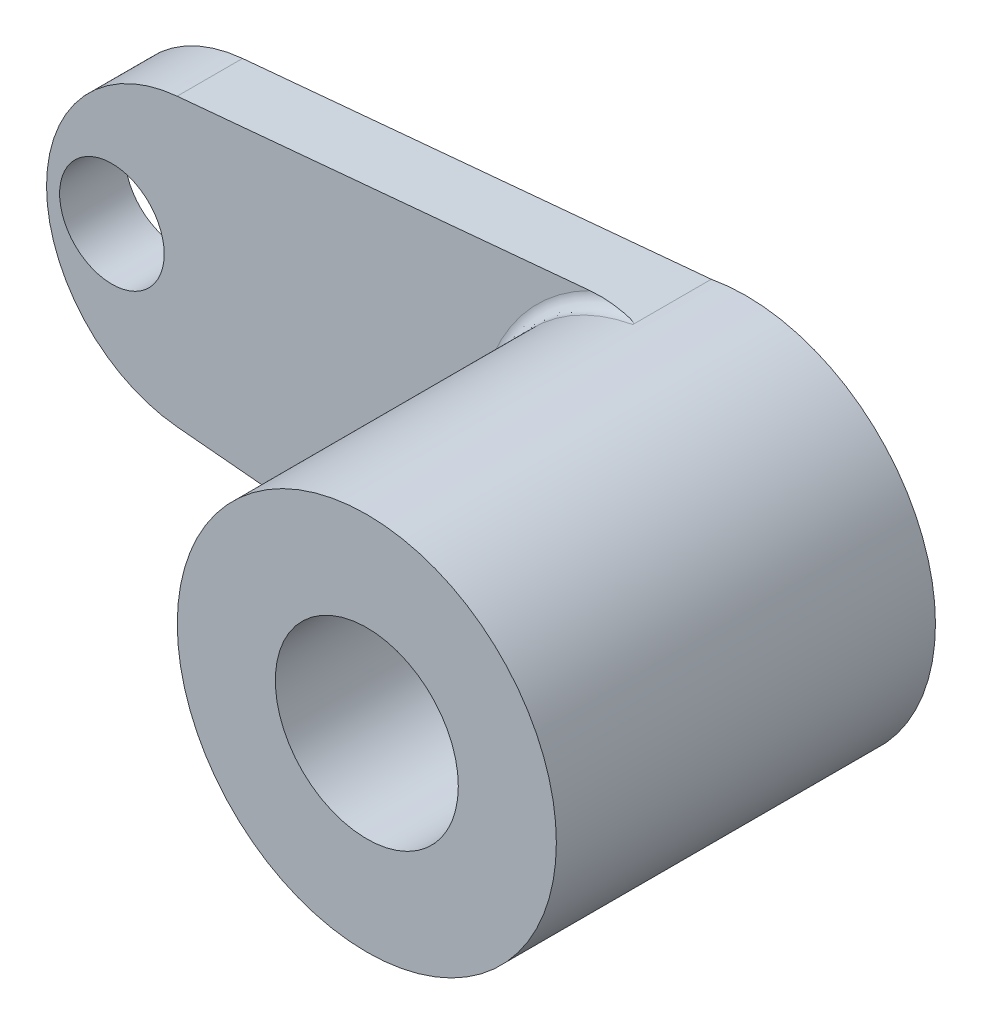
ISO-10303-21;
HEADER;
FILE_DESCRIPTION(('STEP AP214'),'2;1');
FILE_NAME('part.step','',(''),(''),'','','');
FILE_SCHEMA(('AUTOMOTIVE_DESIGN { 1 0 10303 214 1 1 1 1 }'));
ENDSEC;
DATA;
#1=APPLICATION_CONTEXT('core data for automotive mechanical design processes');
#2=APPLICATION_PROTOCOL_DEFINITION('international standard','automotive_design',2000,#1);
#3=PRODUCT_CONTEXT('',#1,'mechanical');
#4=PRODUCT('Part','Part','',(#3));
#5=PRODUCT_RELATED_PRODUCT_CATEGORY('part','',(#4));
#6=PRODUCT_DEFINITION_FORMATION('','',#4);
#7=PRODUCT_DEFINITION_CONTEXT('part definition',#1,'design');
#8=PRODUCT_DEFINITION('design','',#6,#7);
#9=PRODUCT_DEFINITION_SHAPE('','',#8);
#10=(LENGTH_UNIT() NAMED_UNIT(*) SI_UNIT(.MILLI.,.METRE.));
#11=(NAMED_UNIT(*) PLANE_ANGLE_UNIT() SI_UNIT($,.RADIAN.));
#12=(NAMED_UNIT(*) SI_UNIT($,.STERADIAN.) SOLID_ANGLE_UNIT());
#13=UNCERTAINTY_MEASURE_WITH_UNIT(LENGTH_MEASURE(1.E-05),#10,'distance_accuracy_value','');
#14=(GEOMETRIC_REPRESENTATION_CONTEXT(3) GLOBAL_UNCERTAINTY_ASSIGNED_CONTEXT((#13)) GLOBAL_UNIT_ASSIGNED_CONTEXT((#10,
#11,#12)) REPRESENTATION_CONTEXT('',''));
#15=CARTESIAN_POINT('',(0.,0.,0.));
#16=DIRECTION('',(0.,0.,1.));
#17=DIRECTION('',(1.,0.,0.));
#18=AXIS2_PLACEMENT_3D('',#15,#16,#17);
#19=CARTESIAN_POINT('',(0.,0.,29.));
#20=DIRECTION('',(0.,0.,-1.));
#21=DIRECTION('',(-1.,0.,0.));
#22=AXIS2_PLACEMENT_3D('',#19,#20,#21);
#23=CYLINDRICAL_SURFACE('',#22,14.5);
#24=DIRECTION('',(0.,0.,-1.));
#25=VECTOR('',#24,1.);
#26=CARTESIAN_POINT('',(-2.6482111556909,14.2561207091857,29.));
#27=LINE('',#26,#25);
#28=CARTESIAN_POINT('',(-2.6482111556909,14.2561207091857,6.));
#29=VERTEX_POINT('',#28);
#30=CARTESIAN_POINT('',(-2.64821115569092,14.2561207091857,0.));
#31=VERTEX_POINT('',#30);
#32=EDGE_CURVE('E80',#29,#31,#27,.T.);
#33=ORIENTED_EDGE('',*,*,#32,.F.);
#34=CARTESIAN_POINT('',(0.,0.,6.));
#35=DIRECTION('',(0.,0.,-1.));
#36=DIRECTION('',(-1.,0.,0.));
#37=AXIS2_PLACEMENT_3D('',#34,#35,#36);
#38=CIRCLE('',#37,14.5);
#39=CARTESIAN_POINT('',(-2.64821115569089,-14.2561207091857,6.00000000000001));
#40=VERTEX_POINT('',#39);
#41=EDGE_CURVE('E159',#29,#40,#38,.F.);
#42=ORIENTED_EDGE('',*,*,#41,.T.);
#43=DIRECTION('',(0.,0.,-1.));
#44=VECTOR('',#43,1.);
#45=CARTESIAN_POINT('',(-2.64821115569089,-14.2561207091857,29.));
#46=LINE('',#45,#44);
#47=CARTESIAN_POINT('',(-2.64821115569088,-14.2561207091857,0.));
#48=VERTEX_POINT('',#47);
#49=EDGE_CURVE('E87',#48,#40,#46,.F.);
#50=ORIENTED_EDGE('',*,*,#49,.F.);
#51=CARTESIAN_POINT('',(0.,0.,0.));
#52=DIRECTION('',(0.,0.,1.));
#53=DIRECTION('',(1.,0.,0.));
#54=AXIS2_PLACEMENT_3D('',#51,#52,#53);
#55=CIRCLE('',#54,14.5);
#56=EDGE_CURVE('E150',#48,#31,#55,.T.);
#57=ORIENTED_EDGE('',*,*,#56,.T.);
#58=EDGE_LOOP('',(#33,#42,#50,#57));
#59=FACE_BOUND('',#58,.T.);
#60=CARTESIAN_POINT('',(0.,0.,29.));
#61=DIRECTION('',(0.,0.,1.));
#62=DIRECTION('',(1.,0.,0.));
#63=AXIS2_PLACEMENT_3D('',#60,#61,#62);
#64=CIRCLE('',#63,14.5);
#65=CARTESIAN_POINT('',(14.5,0.,29.));
#66=VERTEX_POINT('',#65);
#67=EDGE_CURVE('E151',#66,#66,#64,.T.);
#68=ORIENTED_EDGE('',*,*,#67,.F.);
#69=EDGE_LOOP('',(#68));
#70=FACE_BOUND('',#69,.T.);
#71=ADVANCED_FACE('F58',(#59,#70),#23,.T.);
#72=CARTESIAN_POINT('',(0.,0.,29.));
#73=DIRECTION('',(0.,0.,1.));
#74=DIRECTION('',(1.,0.,0.));
#75=AXIS2_PLACEMENT_3D('',#72,#73,#74);
#76=PLANE('',#75);
#77=CARTESIAN_POINT('',(0.,0.,29.));
#78=DIRECTION('',(0.,0.,1.));
#79=DIRECTION('',(1.,0.,0.));
#80=AXIS2_PLACEMENT_3D('',#77,#78,#79);
#81=CIRCLE('',#80,7.);
#82=CARTESIAN_POINT('',(7.,0.,29.));
#83=VERTEX_POINT('',#82);
#84=EDGE_CURVE('E304',#83,#83,#81,.T.);
#85=ORIENTED_EDGE('',*,*,#84,.F.);
#86=EDGE_LOOP('',(#85));
#87=FACE_BOUND('',#86,.T.);
#88=ORIENTED_EDGE('',*,*,#67,.T.);
#89=EDGE_LOOP('',(#88));
#90=FACE_BOUND('',#89,.T.);
#91=ADVANCED_FACE('F173',(#87,#90),#76,.T.);
#92=CARTESIAN_POINT('',(0.,0.,0.));
#93=DIRECTION('',(0.,0.,1.));
#94=DIRECTION('',(1.,0.,0.));
#95=AXIS2_PLACEMENT_3D('',#92,#93,#94);
#96=PLANE('',#95);
#97=ORIENTED_EDGE('',*,*,#56,.F.);
#98=DIRECTION('',(0.99578630703694,-0.0917040387209497,0.));
#99=VECTOR('',#98,1.);
#100=CARTESIAN_POINT('',(0.,-14.5,0.));
#101=LINE('',#100,#99);
#102=CARTESIAN_POINT('',(-38.5087444259304,-10.9536493774064,0.));
#103=VERTEX_POINT('',#102);
#104=EDGE_CURVE('E124',#103,#48,#101,.T.);
#105=ORIENTED_EDGE('',*,*,#104,.F.);
#106=CARTESIAN_POINT('',(-37.5,0.,0.));
#107=DIRECTION('',(0.,0.,1.));
#108=DIRECTION('',(-1.,0.,0.));
#109=AXIS2_PLACEMENT_3D('',#106,#107,#108);
#110=CIRCLE('',#109,11.);
#111=CARTESIAN_POINT('',(-38.5087444259304,10.9536493774063,0.));
#112=VERTEX_POINT('',#111);
#113=EDGE_CURVE('E321',#112,#103,#110,.T.);
#114=ORIENTED_EDGE('',*,*,#113,.F.);
#115=DIRECTION('',(-0.99578630703694,-0.0917040387209499,0.));
#116=VECTOR('',#115,1.);
#117=CARTESIAN_POINT('',(-38.5087444259304,10.9536493774063,0.));
#118=LINE('',#117,#116);
#119=EDGE_CURVE('E138',#31,#112,#118,.T.);
#120=ORIENTED_EDGE('',*,*,#119,.F.);
#121=EDGE_LOOP('',(#97,#105,#114,#120));
#122=FACE_BOUND('',#121,.T.);
#123=CARTESIAN_POINT('',(-43.5,0.,0.));
#124=DIRECTION('',(0.,0.,1.));
#125=DIRECTION('',(1.,0.,0.));
#126=AXIS2_PLACEMENT_3D('',#123,#124,#125);
#127=CIRCLE('',#126,4.00000000000001);
#128=CARTESIAN_POINT('',(-39.5,0.,0.));
#129=VERTEX_POINT('',#128);
#130=EDGE_CURVE('E303',#129,#129,#127,.T.);
#131=ORIENTED_EDGE('',*,*,#130,.T.);
#132=EDGE_LOOP('',(#131));
#133=FACE_BOUND('',#132,.T.);
#134=ADVANCED_FACE('F172',(#122,#133),#96,.F.);
#135=CARTESIAN_POINT('',(-38.5087444259304,10.9536493774063,5.));
#136=DIRECTION('',(0.0917040387209499,-0.99578630703694,0.));
#137=DIRECTION('',(0.99578630703694,0.0917040387209499,0.));
#138=AXIS2_PLACEMENT_3D('',#135,#136,#137);
#139=PLANE('',#138);
#140=DIRECTION('',(-0.99578630703694,-0.0917040387209499,0.));
#141=VECTOR('',#140,1.);
#142=CARTESIAN_POINT('',(-38.5087444259304,10.9536493774063,5.));
#143=LINE('',#142,#141);
#144=CARTESIAN_POINT('',(-6.93667777424074,13.8611868704074,5.));
#145=VERTEX_POINT('',#144);
#146=CARTESIAN_POINT('',(-38.5087444259304,10.9536493774063,5.));
#147=VERTEX_POINT('',#146);
#148=EDGE_CURVE('E112',#145,#147,#143,.T.);
#149=ORIENTED_EDGE('',*,*,#148,.F.);
#150=CARTESIAN_POINT('',(-6.93667777424074,13.8611868704074,5.));
#151=CARTESIAN_POINT('',(-6.85299282699616,13.8688935918076,5.0000075013178));
#152=CARTESIAN_POINT('',(-6.76931945930559,13.8765992468225,5.00139986394996));
#153=CARTESIAN_POINT('',(-6.60206559650059,13.8920020040231,5.00669206272959));
#154=CARTESIAN_POINT('',(-6.51848508706881,13.8996991075272,5.0105914349615));
#155=CARTESIAN_POINT('',(-6.26806428942485,13.9227608812846,5.02565026518585));
#156=CARTESIAN_POINT('',(-6.10142098784308,13.9381074106282,5.04017122382582));
#157=CARTESIAN_POINT('',(-5.76927871213132,13.9686950858126,5.07660205589314));
#158=CARTESIAN_POINT('',(-5.60377819347057,13.9839363738925,5.09849824024747));
#159=CARTESIAN_POINT('',(-5.27371060226985,14.0143329870515,5.1485960372674));
#160=CARTESIAN_POINT('',(-5.10914365600588,14.0294883005015,5.1767984830119));
#161=CARTESIAN_POINT('',(-4.81246795749449,14.0568097845906,5.23284823974964));
#162=CARTESIAN_POINT('',(-4.6801762511237,14.0689928038567,5.25973008096272));
#163=CARTESIAN_POINT('',(-4.4163296828849,14.0932909848411,5.31695874594889));
#164=CARTESIAN_POINT('',(-4.28477485460665,14.1054061434661,5.34730572634957));
#165=CARTESIAN_POINT('',(-4.06486277260407,14.1256583059437,5.40119005855448));
#166=CARTESIAN_POINT('',(-3.97627067645816,14.133816936925,5.4237629967695));
#167=CARTESIAN_POINT('',(-3.79956849879318,14.1500898091549,5.47073109244406));
#168=CARTESIAN_POINT('',(-3.71145840889845,14.1582040511748,5.49512621813145));
#169=CARTESIAN_POINT('',(-3.50559635669351,14.1771623170931,5.55485656601036));
#170=CARTESIAN_POINT('',(-3.38809018076874,14.1879837060104,5.59106534041817));
#171=CARTESIAN_POINT('',(-3.19345207440177,14.2059083353377,5.65703297575751));
#172=CARTESIAN_POINT('',(-3.11573675050114,14.2130653016685,5.68500364416348));
#173=CARTESIAN_POINT('',(-2.98742635507683,14.2248816737025,5.73646584876283));
#174=CARTESIAN_POINT('',(-2.93624432855424,14.2295951333162,5.75844790851796));
#175=CARTESIAN_POINT('',(-2.85206389176173,14.2373474853827,5.79945643483384));
#176=CARTESIAN_POINT('',(-2.81847663579057,14.2404406058648,5.81718622424741));
#177=CARTESIAN_POINT('',(-2.76973582747598,14.2449292486001,5.84720068180738));
#178=CARTESIAN_POINT('',(-2.75361954737436,14.2464134304612,5.85789201830023));
#179=CARTESIAN_POINT('',(-2.72264503901645,14.2492659375641,5.88098659632882));
#180=CARTESIAN_POINT('',(-2.70778239573384,14.2506346693949,5.89338338753352));
#181=CARTESIAN_POINT('',(-2.6888492024695,14.2523782666667,5.9127495714823));
#182=CARTESIAN_POINT('',(-2.68361939227265,14.2528598907997,5.91855910278153));
#183=CARTESIAN_POINT('',(-2.67384085538547,14.2537604166645,5.93074580478831));
#184=CARTESIAN_POINT('',(-2.66929212401009,14.2541793188278,5.93712297159068));
#185=CARTESIAN_POINT('',(-2.66193502196757,14.2548568497055,5.94931845312367));
#186=CARTESIAN_POINT('',(-2.65896099137128,14.2551307343884,5.95503422147731));
#187=CARTESIAN_POINT('',(-2.65397531496476,14.2555898757313,5.96686510347759));
#188=CARTESIAN_POINT('',(-2.65195975923897,14.2557754924635,5.9729784770024));
#189=CARTESIAN_POINT('',(-2.64978658499911,14.2559756246136,5.98262586976246));
#190=CARTESIAN_POINT('',(-2.64920085202177,14.2560295659856,5.98606462540594));
#191=CARTESIAN_POINT('',(-2.64841093265303,14.2561023113085,5.99300092921581));
#192=CARTESIAN_POINT('',(-2.64820842546727,14.2561209606177,5.9964986686851));
#193=CARTESIAN_POINT('',(-2.64821115569094,14.2561207091857,6.00000000000001));
#194=B_SPLINE_CURVE_WITH_KNOTS('',3,(#150,#151,#152,#153,#154,#155,#156,#157,#158,#159,#160,
#161,#162,#163,#164,#165,#166,#167,#168,#169,#170,#171,#172,#173,#174,#175,#176,#177,#178,#179,
#180,#181,#182,#183,#184,#185,#186,#187,#188,#189,#190,#191,#192,#193),.UNSPECIFIED.,.F.,.F.,(4,
2,2,2,2,2,2,2,2,2,2,2,2,2,2,2,2,2,2,2,2,4),(0.,0.252087539494782,0.50412844427179,
1.00783797668702,1.51061768478898,2.01346385110626,2.42005200307458,2.82665854049418,
3.10199940846118,3.37733547662814,3.74752910919021,3.99612227275271,4.16372716156553,
4.27782681604209,4.33597444771913,4.39390790990578,4.41736854218053,4.44082901306551,
4.4601139602958,4.47931954869111,4.48976573065297,4.50025758029772),.UNSPECIFIED.);
#195=EDGE_CURVE('E73',#145,#29,#194,.T.);
#196=ORIENTED_EDGE('',*,*,#195,.T.);
#197=ORIENTED_EDGE('',*,*,#32,.T.);
#198=ORIENTED_EDGE('',*,*,#119,.T.);
#199=DIRECTION('',(0.,0.,-1.));
#200=VECTOR('',#199,1.);
#201=CARTESIAN_POINT('',(-38.5087444259304,10.9536493774063,5.));
#202=LINE('',#201,#200);
#203=EDGE_CURVE('E129',#147,#112,#202,.T.);
#204=ORIENTED_EDGE('',*,*,#203,.F.);
#205=EDGE_LOOP('',(#149,#196,#197,#198,#204));
#206=FACE_BOUND('',#205,.T.);
#207=ADVANCED_FACE('F136',(#206),#139,.F.);
#208=CARTESIAN_POINT('',(0.,-14.5,5.));
#209=DIRECTION('',(0.0917040387209497,0.99578630703694,0.));
#210=DIRECTION('',(-0.99578630703694,0.0917040387209497,0.));
#211=AXIS2_PLACEMENT_3D('',#208,#209,#210);
#212=PLANE('',#211);
#213=ORIENTED_EDGE('',*,*,#104,.T.);
#214=ORIENTED_EDGE('',*,*,#49,.T.);
#215=CARTESIAN_POINT('',(-2.64821115569089,-14.2561207091857,6.));
#216=CARTESIAN_POINT('',(-2.64818395076614,-14.256123214544,5.99344241477053));
#217=CARTESIAN_POINT('',(-2.64891034883229,-14.2560563190305,5.98693060345599));
#218=CARTESIAN_POINT('',(-2.65159127037677,-14.2558094273717,5.97429101833034));
#219=CARTESIAN_POINT('',(-2.65352191757657,-14.2556316300428,5.96815826847742));
#220=CARTESIAN_POINT('',(-2.65904696233679,-14.2551228171428,5.95459563674822));
#221=CARTESIAN_POINT('',(-2.66296055369208,-14.2547624063492,5.94730154289751));
#222=CARTESIAN_POINT('',(-2.67187786038817,-14.2539411929696,5.93336554436053));
#223=CARTESIAN_POINT('',(-2.67689039961407,-14.2534795777737,5.92672958964733));
#224=CARTESIAN_POINT('',(-2.69559644792373,-14.2517568987547,5.90457079961358));
#225=CARTESIAN_POINT('',(-2.71106234047226,-14.2503326124404,5.89059797248968));
#226=CARTESIAN_POINT('',(-2.74366160223845,-14.247330478406,5.86483036562478));
#227=CARTESIAN_POINT('',(-2.76080378161039,-14.2457518193405,5.85304815444882));
#228=CARTESIAN_POINT('',(-2.81471627392493,-14.240786905435,5.81895996513736));
#229=CARTESIAN_POINT('',(-2.85286884036394,-14.2372733559864,5.79887764223783));
#230=CARTESIAN_POINT('',(-2.93050324303517,-14.2301238418604,5.76145230811009));
#231=CARTESIAN_POINT('',(-2.96998879405313,-14.2264875350806,5.74411787888462));
#232=CARTESIAN_POINT('',(-3.04976506888857,-14.219140771478,5.71115248112792));
#233=CARTESIAN_POINT('',(-3.09005730276094,-14.215430175591,5.69552514777285));
#234=CARTESIAN_POINT('',(-3.17100576875959,-14.2079754624584,5.66547902168941));
#235=CARTESIAN_POINT('',(-3.21166135291615,-14.2042314048857,5.65105842426453));
#236=CARTESIAN_POINT('',(-3.33337353780344,-14.1930226758272,5.60933033528214));
#237=CARTESIAN_POINT('',(-3.41486061968587,-14.185518360434,5.58328897285028));
#238=CARTESIAN_POINT('',(-3.57850977411046,-14.1704475683495,5.53342866414781));
#239=CARTESIAN_POINT('',(-3.66067198230111,-14.1628810791659,5.50961017700335));
#240=CARTESIAN_POINT('',(-3.90804819259593,-14.14009968781,5.44068281484697));
#241=CARTESIAN_POINT('',(-4.07397890892902,-14.1248187819288,5.39815806711268));
#242=CARTESIAN_POINT('',(-4.40661433888376,-14.0941856911412,5.31880087389181));
#243=CARTESIAN_POINT('',(-4.57331495659113,-14.078833883436,5.28195088571069));
#244=CARTESIAN_POINT('',(-4.90778091337787,-14.0480322156131,5.21390122970873));
#245=CARTESIAN_POINT('',(-5.07554569525965,-14.0325824068087,5.18269882284735));
#246=CARTESIAN_POINT('',(-5.38357246333374,-14.0042155790396,5.13129528105716));
#247=CARTESIAN_POINT('',(-5.52367392349118,-13.9913133432523,5.11012585014669));
#248=CARTESIAN_POINT('',(-5.80452550523027,-13.9654491350938,5.07266164277131));
#249=CARTESIAN_POINT('',(-5.94527561441448,-13.9524871638642,5.05636677352945));
#250=CARTESIAN_POINT('',(-6.22759277270149,-13.9264879877034,5.0293829208027));
#251=CARTESIAN_POINT('',(-6.36916086045805,-13.9134506871204,5.01870453937307));
#252=CARTESIAN_POINT('',(-6.5817952696038,-13.893868740721,5.00768884315166));
#253=CARTESIAN_POINT('',(-6.65273602099492,-13.8873356589076,5.00485051698225));
#254=CARTESIAN_POINT('',(-6.7946748908223,-13.8742642122301,5.00100798436555));
#255=CARTESIAN_POINT('',(-6.86567301529627,-13.8677258468099,5.0000040060844));
#256=CARTESIAN_POINT('',(-6.93667777424074,-13.8611868704074,5.));
#257=B_SPLINE_CURVE_WITH_KNOTS('',3,(#215,#216,#217,#218,#219,#220,#221,#222,#223,#224,#225,
#226,#227,#228,#229,#230,#231,#232,#233,#234,#235,#236,#237,#238,#239,#240,#241,#242,#243,#244,
#245,#246,#247,#248,#249,#250,#251,#252,#253,#254,#255,#256),.UNSPECIFIED.,.F.,.F.,(4,2,2,2,2,2,
2,2,2,2,2,2,2,2,2,2,2,2,2,2,4),(0.,0.019559445190321,0.0387429053572005,0.063457094969219,
0.0883775085559427,0.150563879312251,0.213096717035703,0.342516835322766,0.472333506664483,
0.602421438183097,0.732311207997968,0.989878265367841,1.24749840500393,1.76328548369003,
2.27744461003198,2.7913537003968,3.21811452167305,3.64486721994404,4.07242261973058,
4.2862940266519,4.50019203424907),.UNSPECIFIED.);
#258=CARTESIAN_POINT('',(-6.93667777424074,-13.8611868704074,5.));
#259=VERTEX_POINT('',#258);
#260=EDGE_CURVE('E13',#40,#259,#257,.T.);
#261=ORIENTED_EDGE('',*,*,#260,.T.);
#262=DIRECTION('',(0.99578630703694,-0.0917040387209497,0.));
#263=VECTOR('',#262,1.);
#264=CARTESIAN_POINT('',(0.,-14.5,5.));
#265=LINE('',#264,#263);
#266=CARTESIAN_POINT('',(-38.5087444259304,-10.9536493774064,5.));
#267=VERTEX_POINT('',#266);
#268=EDGE_CURVE('E134',#267,#259,#265,.T.);
#269=ORIENTED_EDGE('',*,*,#268,.F.);
#270=DIRECTION('',(0.,0.,-1.));
#271=VECTOR('',#270,1.);
#272=CARTESIAN_POINT('',(-38.5087444259304,-10.9536493774064,5.));
#273=LINE('',#272,#271);
#274=EDGE_CURVE('E131',#267,#103,#273,.T.);
#275=ORIENTED_EDGE('',*,*,#274,.T.);
#276=EDGE_LOOP('',(#213,#214,#261,#269,#275));
#277=FACE_BOUND('',#276,.T.);
#278=ADVANCED_FACE('F171',(#277),#212,.F.);
#279=CARTESIAN_POINT('',(-37.5,0.,5.));
#280=DIRECTION('',(0.,0.,-1.));
#281=DIRECTION('',(-1.,0.,0.));
#282=AXIS2_PLACEMENT_3D('',#279,#280,#281);
#283=PLANE('',#282);
#284=ORIENTED_EDGE('',*,*,#268,.T.);
#285=CARTESIAN_POINT('',(0.,0.,5.));
#286=DIRECTION('',(0.,0.,-1.));
#287=DIRECTION('',(-1.,0.,0.));
#288=AXIS2_PLACEMENT_3D('',#285,#286,#287);
#289=CIRCLE('',#288,15.5);
#290=EDGE_CURVE('E120',#259,#145,#289,.T.);
#291=ORIENTED_EDGE('',*,*,#290,.T.);
#292=ORIENTED_EDGE('',*,*,#148,.T.);
#293=CARTESIAN_POINT('',(-37.5,0.,5.));
#294=DIRECTION('',(0.,0.,1.));
#295=DIRECTION('',(-1.,0.,0.));
#296=AXIS2_PLACEMENT_3D('',#293,#294,#295);
#297=CIRCLE('',#296,11.);
#298=EDGE_CURVE('E117',#147,#267,#297,.T.);
#299=ORIENTED_EDGE('',*,*,#298,.T.);
#300=EDGE_LOOP('',(#284,#291,#292,#299));
#301=FACE_BOUND('',#300,.T.);
#302=CARTESIAN_POINT('',(-43.5,0.,5.));
#303=DIRECTION('',(0.,0.,1.));
#304=DIRECTION('',(1.,0.,0.));
#305=AXIS2_PLACEMENT_3D('',#302,#303,#304);
#306=CIRCLE('',#305,4.00000000000001);
#307=CARTESIAN_POINT('',(-39.5,0.,5.));
#308=VERTEX_POINT('',#307);
#309=EDGE_CURVE('E309',#308,#308,#306,.T.);
#310=ORIENTED_EDGE('',*,*,#309,.F.);
#311=EDGE_LOOP('',(#310));
#312=FACE_BOUND('',#311,.T.);
#313=ADVANCED_FACE('F115',(#301,#312),#283,.F.);
#314=CARTESIAN_POINT('',(-37.5,0.,5.));
#315=DIRECTION('',(0.,0.,-1.));
#316=DIRECTION('',(-1.,0.,0.));
#317=AXIS2_PLACEMENT_3D('',#314,#315,#316);
#318=CYLINDRICAL_SURFACE('',#317,11.);
#319=ORIENTED_EDGE('',*,*,#113,.T.);
#320=ORIENTED_EDGE('',*,*,#274,.F.);
#321=ORIENTED_EDGE('',*,*,#298,.F.);
#322=ORIENTED_EDGE('',*,*,#203,.T.);
#323=EDGE_LOOP('',(#319,#320,#321,#322));
#324=FACE_BOUND('',#323,.T.);
#325=ADVANCED_FACE('F128',(#324),#318,.T.);
#326=CARTESIAN_POINT('',(-43.5,0.,5.));
#327=DIRECTION('',(0.,0.,-1.));
#328=DIRECTION('',(-1.,0.,0.));
#329=AXIS2_PLACEMENT_3D('',#326,#327,#328);
#330=CYLINDRICAL_SURFACE('',#329,4.00000000000001);
#331=ORIENTED_EDGE('',*,*,#309,.T.);
#332=EDGE_LOOP('',(#331));
#333=FACE_BOUND('',#332,.T.);
#334=ORIENTED_EDGE('',*,*,#130,.F.);
#335=EDGE_LOOP('',(#334));
#336=FACE_BOUND('',#335,.T.);
#337=ADVANCED_FACE('F217',(#333,#336),#330,.F.);
#338=CARTESIAN_POINT('',(0.,0.,6.));
#339=DIRECTION('',(0.,0.,-1.));
#340=DIRECTION('',(-1.,0.,0.));
#341=AXIS2_PLACEMENT_3D('',#338,#339,#340);
#342=TOROIDAL_SURFACE('',#341,15.5,1.);
#343=ORIENTED_EDGE('',*,*,#260,.F.);
#344=ORIENTED_EDGE('',*,*,#41,.F.);
#345=ORIENTED_EDGE('',*,*,#195,.F.);
#346=ORIENTED_EDGE('',*,*,#290,.F.);
#347=EDGE_LOOP('',(#343,#344,#345,#346));
#348=FACE_BOUND('',#347,.T.);
#349=ADVANCED_FACE('F60',(#348),#342,.F.);
#350=CARTESIAN_POINT('',(0.,0.,4.));
#351=DIRECTION('',(0.,0.,1.));
#352=DIRECTION('',(1.,0.,0.));
#353=AXIS2_PLACEMENT_3D('',#350,#351,#352);
#354=CYLINDRICAL_SURFACE('',#353,7.);
#355=CARTESIAN_POINT('',(0.,0.,4.));
#356=DIRECTION('',(0.,0.,1.));
#357=DIRECTION('',(1.,0.,0.));
#358=AXIS2_PLACEMENT_3D('',#355,#356,#357);
#359=CIRCLE('',#358,7.);
#360=CARTESIAN_POINT('',(7.,0.,4.));
#361=VERTEX_POINT('',#360);
#362=EDGE_CURVE('E301',#361,#361,#359,.T.);
#363=ORIENTED_EDGE('',*,*,#362,.F.);
#364=EDGE_LOOP('',(#363));
#365=FACE_BOUND('',#364,.T.);
#366=ORIENTED_EDGE('',*,*,#84,.T.);
#367=EDGE_LOOP('',(#366));
#368=FACE_BOUND('',#367,.T.);
#369=ADVANCED_FACE('F228',(#365,#368),#354,.F.);
#370=CARTESIAN_POINT('',(0.,0.,4.));
#371=DIRECTION('',(0.,0.,1.));
#372=DIRECTION('',(1.,0.,0.));
#373=AXIS2_PLACEMENT_3D('',#370,#371,#372);
#374=PLANE('',#373);
#375=ORIENTED_EDGE('',*,*,#362,.T.);
#376=EDGE_LOOP('',(#375));
#377=FACE_BOUND('',#376,.T.);
#378=ADVANCED_FACE('F235',(#377),#374,.T.);
#379=CLOSED_SHELL('',(#71,#91,#134,#207,#278,#313,#325,#337,#349,#369,#378));
#380=MANIFOLD_SOLID_BREP('B2',#379);
#381=ADVANCED_BREP_SHAPE_REPRESENTATION('',(#18,#380),#14);
#382=SHAPE_DEFINITION_REPRESENTATION(#9,#381);
ENDSEC;
END-ISO-10303-21;
